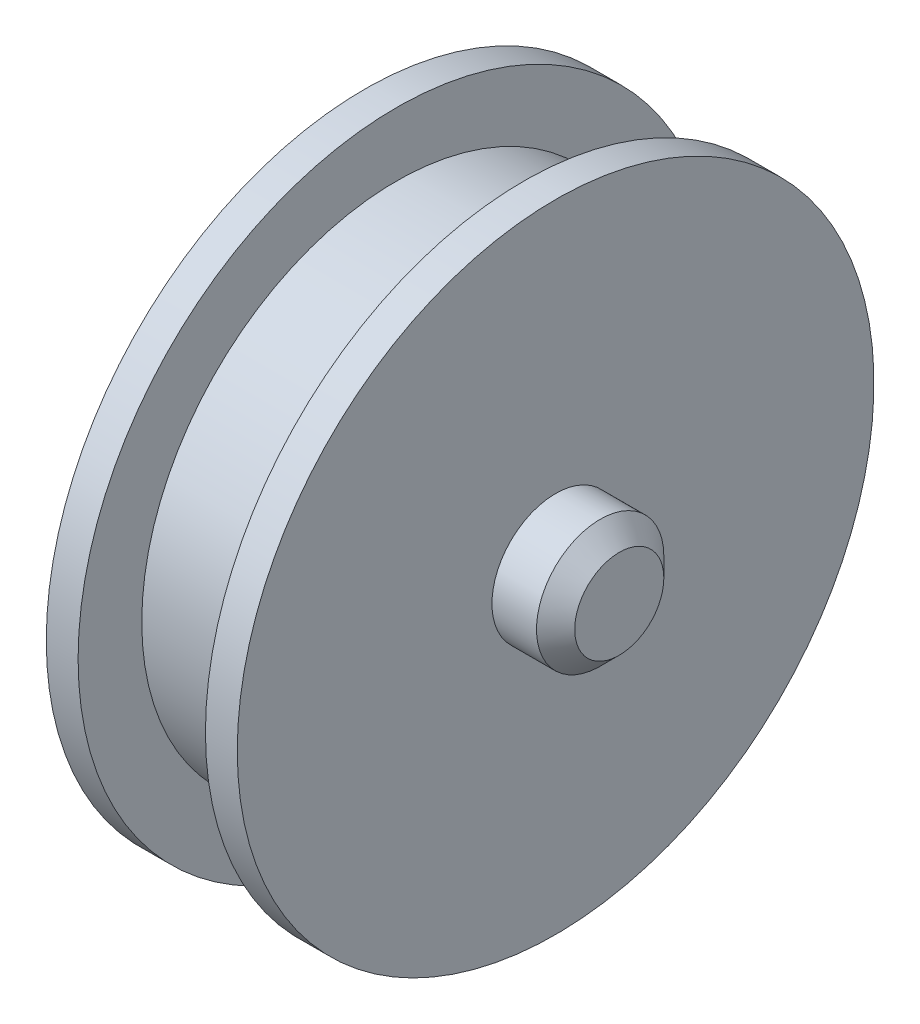
ISO-10303-21;
HEADER;
FILE_DESCRIPTION(('STEP AP214'),'2;1');
FILE_NAME('part.step','',(''),(''),'','','');
FILE_SCHEMA(('AUTOMOTIVE_DESIGN { 1 0 10303 214 1 1 1 1 }'));
ENDSEC;
DATA;
#1=APPLICATION_CONTEXT('core data for automotive mechanical design processes');
#2=APPLICATION_PROTOCOL_DEFINITION('international standard','automotive_design',2000,#1);
#3=PRODUCT_CONTEXT('',#1,'mechanical');
#4=PRODUCT('Part','Part','',(#3));
#5=PRODUCT_RELATED_PRODUCT_CATEGORY('part','',(#4));
#6=PRODUCT_DEFINITION_FORMATION('','',#4);
#7=PRODUCT_DEFINITION_CONTEXT('part definition',#1,'design');
#8=PRODUCT_DEFINITION('design','',#6,#7);
#9=PRODUCT_DEFINITION_SHAPE('','',#8);
#10=(LENGTH_UNIT() NAMED_UNIT(*) SI_UNIT(.MILLI.,.METRE.));
#11=(NAMED_UNIT(*) PLANE_ANGLE_UNIT() SI_UNIT($,.RADIAN.));
#12=(NAMED_UNIT(*) SI_UNIT($,.STERADIAN.) SOLID_ANGLE_UNIT());
#13=UNCERTAINTY_MEASURE_WITH_UNIT(LENGTH_MEASURE(1.E-05),#10,'distance_accuracy_value','');
#14=(GEOMETRIC_REPRESENTATION_CONTEXT(3) GLOBAL_UNCERTAINTY_ASSIGNED_CONTEXT((#13)) GLOBAL_UNIT_ASSIGNED_CONTEXT((#10,
#11,#12)) REPRESENTATION_CONTEXT('',''));
#15=CARTESIAN_POINT('',(0.,0.,0.));
#16=DIRECTION('',(0.,0.,1.));
#17=DIRECTION('',(1.,0.,0.));
#18=AXIS2_PLACEMENT_3D('',#15,#16,#17);
#19=CARTESIAN_POINT('',(-1.5,0.,0.));
#20=DIRECTION('',(1.,0.,0.));
#21=DIRECTION('',(0.,0.,-1.));
#22=AXIS2_PLACEMENT_3D('',#19,#20,#21);
#23=PLANE('',#22);
#24=CARTESIAN_POINT('',(-1.5,0.,0.));
#25=DIRECTION('',(-1.,0.,0.));
#26=DIRECTION('',(0.,0.,1.));
#27=AXIS2_PLACEMENT_3D('',#24,#25,#26);
#28=CIRCLE('',#27,1.);
#29=CARTESIAN_POINT('',(-1.5,0.,1.));
#30=VERTEX_POINT('',#29);
#31=EDGE_CURVE('E66',#30,#30,#28,.T.);
#32=ORIENTED_EDGE('',*,*,#31,.F.);
#33=EDGE_LOOP('',(#32));
#34=FACE_BOUND('',#33,.T.);
#35=CARTESIAN_POINT('',(-1.5,0.,0.));
#36=DIRECTION('',(-1.,0.,0.));
#37=DIRECTION('',(0.,0.,1.));
#38=AXIS2_PLACEMENT_3D('',#35,#36,#37);
#39=CIRCLE('',#38,5.);
#40=CARTESIAN_POINT('',(-1.5,0.,5.));
#41=VERTEX_POINT('',#40);
#42=EDGE_CURVE('E79',#41,#41,#39,.T.);
#43=ORIENTED_EDGE('',*,*,#42,.T.);
#44=EDGE_LOOP('',(#43));
#45=FACE_BOUND('',#44,.T.);
#46=ADVANCED_FACE('F41',(#34,#45),#23,.F.);
#47=CARTESIAN_POINT('',(1.5,0.,0.));
#48=DIRECTION('',(1.,0.,0.));
#49=DIRECTION('',(0.,0.,-1.));
#50=AXIS2_PLACEMENT_3D('',#47,#48,#49);
#51=PLANE('',#50);
#52=CARTESIAN_POINT('',(1.5,0.,0.));
#53=DIRECTION('',(1.,0.,0.));
#54=DIRECTION('',(0.,0.,-1.));
#55=AXIS2_PLACEMENT_3D('',#52,#53,#54);
#56=CIRCLE('',#55,1.);
#57=CARTESIAN_POINT('',(1.5,0.,-1.));
#58=VERTEX_POINT('',#57);
#59=EDGE_CURVE('E62',#58,#58,#56,.T.);
#60=ORIENTED_EDGE('',*,*,#59,.F.);
#61=EDGE_LOOP('',(#60));
#62=FACE_BOUND('',#61,.T.);
#63=CARTESIAN_POINT('',(1.5,0.,0.));
#64=DIRECTION('',(-1.,0.,0.));
#65=DIRECTION('',(0.,0.,1.));
#66=AXIS2_PLACEMENT_3D('',#63,#64,#65);
#67=CIRCLE('',#66,5.);
#68=CARTESIAN_POINT('',(1.5,0.,5.));
#69=VERTEX_POINT('',#68);
#70=EDGE_CURVE('E63',#69,#69,#67,.T.);
#71=ORIENTED_EDGE('',*,*,#70,.F.);
#72=EDGE_LOOP('',(#71));
#73=FACE_BOUND('',#72,.T.);
#74=ADVANCED_FACE('F89',(#62,#73),#51,.T.);
#75=CARTESIAN_POINT('',(0.,0.,0.));
#76=DIRECTION('',(-1.,0.,0.));
#77=DIRECTION('',(0.,0.,1.));
#78=AXIS2_PLACEMENT_3D('',#75,#76,#77);
#79=CYLINDRICAL_SURFACE('',#78,5.);
#80=ORIENTED_EDGE('',*,*,#70,.T.);
#81=EDGE_LOOP('',(#80));
#82=FACE_BOUND('',#81,.T.);
#83=CARTESIAN_POINT('',(1.,0.,0.));
#84=DIRECTION('',(-1.,0.,0.));
#85=DIRECTION('',(0.,0.,1.));
#86=AXIS2_PLACEMENT_3D('',#83,#84,#85);
#87=CIRCLE('',#86,5.);
#88=CARTESIAN_POINT('',(1.,0.,5.));
#89=VERTEX_POINT('',#88);
#90=EDGE_CURVE('E67',#89,#89,#87,.T.);
#91=ORIENTED_EDGE('',*,*,#90,.F.);
#92=EDGE_LOOP('',(#91));
#93=FACE_BOUND('',#92,.T.);
#94=ADVANCED_FACE('F92',(#82,#93),#79,.T.);
#95=CARTESIAN_POINT('',(1.,0.,0.));
#96=DIRECTION('',(-1.,0.,0.));
#97=DIRECTION('',(0.,0.,1.));
#98=AXIS2_PLACEMENT_3D('',#95,#96,#97);
#99=PLANE('',#98);
#100=ORIENTED_EDGE('',*,*,#90,.T.);
#101=EDGE_LOOP('',(#100));
#102=FACE_BOUND('',#101,.T.);
#103=CARTESIAN_POINT('',(1.,0.,0.));
#104=DIRECTION('',(-1.,0.,0.));
#105=DIRECTION('',(0.,0.,1.));
#106=AXIS2_PLACEMENT_3D('',#103,#104,#105);
#107=CIRCLE('',#106,4.);
#108=CARTESIAN_POINT('',(1.,0.,4.));
#109=VERTEX_POINT('',#108);
#110=EDGE_CURVE('E70',#109,#109,#107,.T.);
#111=ORIENTED_EDGE('',*,*,#110,.F.);
#112=EDGE_LOOP('',(#111));
#113=FACE_BOUND('',#112,.T.);
#114=ADVANCED_FACE('F98',(#102,#113),#99,.T.);
#115=CARTESIAN_POINT('',(0.,0.,0.));
#116=DIRECTION('',(-1.,0.,0.));
#117=DIRECTION('',(0.,0.,1.));
#118=AXIS2_PLACEMENT_3D('',#115,#116,#117);
#119=CYLINDRICAL_SURFACE('',#118,4.);
#120=ORIENTED_EDGE('',*,*,#110,.T.);
#121=EDGE_LOOP('',(#120));
#122=FACE_BOUND('',#121,.T.);
#123=CARTESIAN_POINT('',(-1.,0.,0.));
#124=DIRECTION('',(-1.,0.,0.));
#125=DIRECTION('',(0.,0.,1.));
#126=AXIS2_PLACEMENT_3D('',#123,#124,#125);
#127=CIRCLE('',#126,4.);
#128=CARTESIAN_POINT('',(-1.,0.,4.));
#129=VERTEX_POINT('',#128);
#130=EDGE_CURVE('E73',#129,#129,#127,.T.);
#131=ORIENTED_EDGE('',*,*,#130,.F.);
#132=EDGE_LOOP('',(#131));
#133=FACE_BOUND('',#132,.T.);
#134=ADVANCED_FACE('F104',(#122,#133),#119,.T.);
#135=CARTESIAN_POINT('',(-1.,0.,0.));
#136=DIRECTION('',(1.,0.,0.));
#137=DIRECTION('',(0.,0.,-1.));
#138=AXIS2_PLACEMENT_3D('',#135,#136,#137);
#139=PLANE('',#138);
#140=ORIENTED_EDGE('',*,*,#130,.T.);
#141=EDGE_LOOP('',(#140));
#142=FACE_BOUND('',#141,.T.);
#143=CARTESIAN_POINT('',(-1.,0.,0.));
#144=DIRECTION('',(-1.,0.,0.));
#145=DIRECTION('',(0.,0.,1.));
#146=AXIS2_PLACEMENT_3D('',#143,#144,#145);
#147=CIRCLE('',#146,5.);
#148=CARTESIAN_POINT('',(-1.,0.,5.));
#149=VERTEX_POINT('',#148);
#150=EDGE_CURVE('E76',#149,#149,#147,.T.);
#151=ORIENTED_EDGE('',*,*,#150,.F.);
#152=EDGE_LOOP('',(#151));
#153=FACE_BOUND('',#152,.T.);
#154=ADVANCED_FACE('F110',(#142,#153),#139,.T.);
#155=CARTESIAN_POINT('',(0.,0.,0.));
#156=DIRECTION('',(-1.,0.,0.));
#157=DIRECTION('',(0.,0.,1.));
#158=AXIS2_PLACEMENT_3D('',#155,#156,#157);
#159=CYLINDRICAL_SURFACE('',#158,5.);
#160=ORIENTED_EDGE('',*,*,#150,.T.);
#161=EDGE_LOOP('',(#160));
#162=FACE_BOUND('',#161,.T.);
#163=ORIENTED_EDGE('',*,*,#42,.F.);
#164=EDGE_LOOP('',(#163));
#165=FACE_BOUND('',#164,.T.);
#166=ADVANCED_FACE('F116',(#162,#165),#159,.T.);
#167=CARTESIAN_POINT('',(-2.5,0.,0.));
#168=DIRECTION('',(1.,0.,0.));
#169=DIRECTION('',(0.,0.,-1.));
#170=AXIS2_PLACEMENT_3D('',#167,#168,#169);
#171=CYLINDRICAL_SURFACE('',#170,1.);
#172=CARTESIAN_POINT('',(-2.2,0.,0.));
#173=DIRECTION('',(-1.,0.,0.));
#174=DIRECTION('',(0.,0.,1.));
#175=AXIS2_PLACEMENT_3D('',#172,#173,#174);
#176=CIRCLE('',#175,1.);
#177=CARTESIAN_POINT('',(-2.2,0.,1.));
#178=VERTEX_POINT('',#177);
#179=EDGE_CURVE('E53',#178,#178,#176,.F.);
#180=ORIENTED_EDGE('',*,*,#179,.T.);
#181=EDGE_LOOP('',(#180));
#182=FACE_BOUND('',#181,.T.);
#183=ORIENTED_EDGE('',*,*,#31,.T.);
#184=EDGE_LOOP('',(#183));
#185=FACE_BOUND('',#184,.T.);
#186=ADVANCED_FACE('F122',(#182,#185),#171,.T.);
#187=CARTESIAN_POINT('',(-2.5,0.,0.));
#188=DIRECTION('',(-1.,0.,0.));
#189=DIRECTION('',(0.,0.,1.));
#190=AXIS2_PLACEMENT_3D('',#187,#188,#189);
#191=PLANE('',#190);
#192=CARTESIAN_POINT('',(-2.5,0.,0.));
#193=DIRECTION('',(-1.,0.,0.));
#194=DIRECTION('',(0.,0.,1.));
#195=AXIS2_PLACEMENT_3D('',#192,#193,#194);
#196=CIRCLE('',#195,0.699999999999998);
#197=CARTESIAN_POINT('',(-2.5,0.,0.699999999999998));
#198=VERTEX_POINT('',#197);
#199=EDGE_CURVE('E57',#198,#198,#196,.T.);
#200=ORIENTED_EDGE('',*,*,#199,.T.);
#201=EDGE_LOOP('',(#200));
#202=FACE_BOUND('',#201,.T.);
#203=ADVANCED_FACE('F149',(#202),#191,.T.);
#204=CARTESIAN_POINT('',(2.5,0.,0.));
#205=DIRECTION('',(-1.,0.,0.));
#206=DIRECTION('',(0.,0.,1.));
#207=AXIS2_PLACEMENT_3D('',#204,#205,#206);
#208=CYLINDRICAL_SURFACE('',#207,1.);
#209=CARTESIAN_POINT('',(2.2,0.,0.));
#210=DIRECTION('',(1.,0.,0.));
#211=DIRECTION('',(0.,0.,-1.));
#212=AXIS2_PLACEMENT_3D('',#209,#210,#211);
#213=CIRCLE('',#212,1.);
#214=CARTESIAN_POINT('',(2.2,0.,-1.));
#215=VERTEX_POINT('',#214);
#216=EDGE_CURVE('E10',#215,#215,#213,.F.);
#217=ORIENTED_EDGE('',*,*,#216,.T.);
#218=EDGE_LOOP('',(#217));
#219=FACE_BOUND('',#218,.T.);
#220=ORIENTED_EDGE('',*,*,#59,.T.);
#221=EDGE_LOOP('',(#220));
#222=FACE_BOUND('',#221,.T.);
#223=ADVANCED_FACE('F87',(#219,#222),#208,.T.);
#224=CARTESIAN_POINT('',(2.5,0.,0.));
#225=DIRECTION('',(1.,0.,0.));
#226=DIRECTION('',(0.,0.,-1.));
#227=AXIS2_PLACEMENT_3D('',#224,#225,#226);
#228=PLANE('',#227);
#229=CARTESIAN_POINT('',(2.5,0.,0.));
#230=DIRECTION('',(1.,0.,0.));
#231=DIRECTION('',(0.,0.,-1.));
#232=AXIS2_PLACEMENT_3D('',#229,#230,#231);
#233=CIRCLE('',#232,0.699999999999998);
#234=CARTESIAN_POINT('',(2.5,0.,-0.699999999999998));
#235=VERTEX_POINT('',#234);
#236=EDGE_CURVE('E49',#235,#235,#233,.T.);
#237=ORIENTED_EDGE('',*,*,#236,.T.);
#238=EDGE_LOOP('',(#237));
#239=FACE_BOUND('',#238,.T.);
#240=ADVANCED_FACE('F137',(#239),#228,.T.);
#241=CARTESIAN_POINT('',(-2.5,0.,0.));
#242=DIRECTION('',(1.,0.,0.));
#243=DIRECTION('',(0.,0.,-1.));
#244=AXIS2_PLACEMENT_3D('',#241,#242,#243);
#245=CONICAL_SURFACE('',#244,0.699999999999998,0.785398163397448);
#246=ORIENTED_EDGE('',*,*,#179,.F.);
#247=EDGE_LOOP('',(#246));
#248=FACE_BOUND('',#247,.T.);
#249=ORIENTED_EDGE('',*,*,#199,.F.);
#250=EDGE_LOOP('',(#249));
#251=FACE_BOUND('',#250,.T.);
#252=ADVANCED_FACE('F133',(#248,#251),#245,.T.);
#253=CARTESIAN_POINT('',(2.5,0.,0.));
#254=DIRECTION('',(-1.,0.,0.));
#255=DIRECTION('',(0.,0.,1.));
#256=AXIS2_PLACEMENT_3D('',#253,#254,#255);
#257=CONICAL_SURFACE('',#256,0.699999999999998,0.785398163397448);
#258=ORIENTED_EDGE('',*,*,#216,.F.);
#259=EDGE_LOOP('',(#258));
#260=FACE_BOUND('',#259,.T.);
#261=ORIENTED_EDGE('',*,*,#236,.F.);
#262=EDGE_LOOP('',(#261));
#263=FACE_BOUND('',#262,.T.);
#264=ADVANCED_FACE('F44',(#260,#263),#257,.T.);
#265=CLOSED_SHELL('',(#46,#74,#94,#114,#134,#154,#166,#186,#203,#223,#240,#252,#264));
#266=MANIFOLD_SOLID_BREP('B2',#265);
#267=ADVANCED_BREP_SHAPE_REPRESENTATION('',(#18,#266),#14);
#268=SHAPE_DEFINITION_REPRESENTATION(#9,#267);
ENDSEC;
END-ISO-10303-21;
